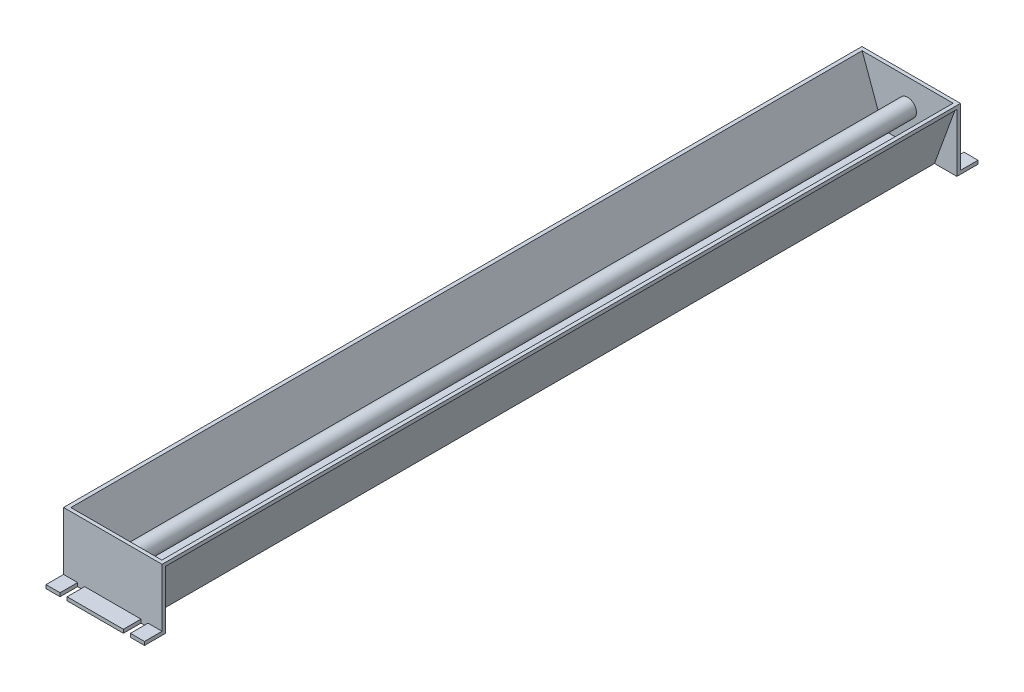
ISO-10303-21;
HEADER;
FILE_DESCRIPTION(('STEP AP214'),'2;1');
FILE_NAME('part.step','',(''),(''),'','','');
FILE_SCHEMA(('AUTOMOTIVE_DESIGN { 1 0 10303 214 1 1 1 1 }'));
ENDSEC;
DATA;
#1=APPLICATION_CONTEXT('core data for automotive mechanical design processes');
#2=APPLICATION_PROTOCOL_DEFINITION('international standard','automotive_design',2000,#1);
#3=PRODUCT_CONTEXT('',#1,'mechanical');
#4=PRODUCT('Part','Part','',(#3));
#5=PRODUCT_RELATED_PRODUCT_CATEGORY('part','',(#4));
#6=PRODUCT_DEFINITION_FORMATION('','',#4);
#7=PRODUCT_DEFINITION_CONTEXT('part definition',#1,'design');
#8=PRODUCT_DEFINITION('design','',#6,#7);
#9=PRODUCT_DEFINITION_SHAPE('','',#8);
#10=(LENGTH_UNIT() NAMED_UNIT(*) SI_UNIT(.MILLI.,.METRE.));
#11=(NAMED_UNIT(*) PLANE_ANGLE_UNIT() SI_UNIT($,.RADIAN.));
#12=(NAMED_UNIT(*) SI_UNIT($,.STERADIAN.) SOLID_ANGLE_UNIT());
#13=UNCERTAINTY_MEASURE_WITH_UNIT(LENGTH_MEASURE(1.E-05),#10,'distance_accuracy_value','');
#14=(GEOMETRIC_REPRESENTATION_CONTEXT(3) GLOBAL_UNCERTAINTY_ASSIGNED_CONTEXT((#13)) GLOBAL_UNIT_ASSIGNED_CONTEXT((#10,
#11,#12)) REPRESENTATION_CONTEXT('',''));
#15=CARTESIAN_POINT('',(0.,0.,0.));
#16=DIRECTION('',(0.,0.,1.));
#17=DIRECTION('',(1.,0.,0.));
#18=AXIS2_PLACEMENT_3D('',#15,#16,#17);
#19=CARTESIAN_POINT('',(0.,2.,-12.));
#20=DIRECTION('',(0.,-1.,0.));
#21=DIRECTION('',(1.,0.,0.));
#22=AXIS2_PLACEMENT_3D('',#19,#20,#21);
#23=PLANE('',#22);
#24=DIRECTION('',(1.,0.,0.));
#25=VECTOR('',#24,1.);
#26=CARTESIAN_POINT('',(0.,2.,-2.));
#27=LINE('',#26,#25);
#28=CARTESIAN_POINT('',(12.,2.,-2.));
#29=VERTEX_POINT('',#28);
#30=CARTESIAN_POINT('',(44.,2.00000000000001,-2.));
#31=VERTEX_POINT('',#30);
#32=EDGE_CURVE('E460',#29,#31,#27,.T.);
#33=ORIENTED_EDGE('',*,*,#32,.T.);
#34=DIRECTION('',(0.,0.,1.));
#35=VECTOR('',#34,1.);
#36=CARTESIAN_POINT('',(44.,2.00000000000001,-12.));
#37=LINE('',#36,#35);
#38=CARTESIAN_POINT('',(44.,2.00000000000001,-12.));
#39=VERTEX_POINT('',#38);
#40=EDGE_CURVE('E408',#39,#31,#37,.T.);
#41=ORIENTED_EDGE('',*,*,#40,.F.);
#42=DIRECTION('',(1.,0.,0.));
#43=VECTOR('',#42,1.);
#44=CARTESIAN_POINT('',(0.,2.,-12.));
#45=LINE('',#44,#43);
#46=CARTESIAN_POINT('',(12.,2.,-12.));
#47=VERTEX_POINT('',#46);
#48=EDGE_CURVE('E449',#47,#39,#45,.T.);
#49=ORIENTED_EDGE('',*,*,#48,.F.);
#50=DIRECTION('',(0.,0.,-1.));
#51=VECTOR('',#50,1.);
#52=CARTESIAN_POINT('',(12.,2.,-12.));
#53=LINE('',#52,#51);
#54=EDGE_CURVE('E100',#29,#47,#53,.T.);
#55=ORIENTED_EDGE('',*,*,#54,.F.);
#56=EDGE_LOOP('',(#33,#41,#49,#55));
#57=FACE_BOUND('',#56,.T.);
#58=ADVANCED_FACE('F77',(#57),#23,.F.);
#59=CARTESIAN_POINT('',(0.,2.,-2.));
#60=VERTEX_POINT('',#59);
#61=CARTESIAN_POINT('',(8.,2.,-2.));
#62=VERTEX_POINT('',#61);
#63=EDGE_CURVE('E444',#60,#62,#27,.T.);
#64=ORIENTED_EDGE('',*,*,#63,.T.);
#65=DIRECTION('',(0.,0.,1.));
#66=VECTOR('',#65,1.);
#67=CARTESIAN_POINT('',(8.,2.,-12.));
#68=LINE('',#67,#66);
#69=CARTESIAN_POINT('',(8.,2.,-12.));
#70=VERTEX_POINT('',#69);
#71=EDGE_CURVE('E415',#70,#62,#68,.T.);
#72=ORIENTED_EDGE('',*,*,#71,.F.);
#73=CARTESIAN_POINT('',(0.,2.,-12.));
#74=VERTEX_POINT('',#73);
#75=EDGE_CURVE('E445',#74,#70,#45,.T.);
#76=ORIENTED_EDGE('',*,*,#75,.F.);
#77=DIRECTION('',(0.,0.,1.));
#78=VECTOR('',#77,1.);
#79=CARTESIAN_POINT('',(0.,2.,-12.));
#80=LINE('',#79,#78);
#81=EDGE_CURVE('E463',#74,#60,#80,.T.);
#82=ORIENTED_EDGE('',*,*,#81,.T.);
#83=EDGE_LOOP('',(#64,#72,#76,#82));
#84=FACE_BOUND('',#83,.T.);
#85=ADVANCED_FACE('F687',(#84),#23,.F.);
#86=CARTESIAN_POINT('',(0.,0.,-12.));
#87=DIRECTION('',(0.,0.,-1.));
#88=DIRECTION('',(-1.,0.,0.));
#89=AXIS2_PLACEMENT_3D('',#86,#87,#88);
#90=PLANE('',#89);
#91=DIRECTION('',(0.,1.,0.));
#92=VECTOR('',#91,1.);
#93=CARTESIAN_POINT('',(44.,0.,-12.));
#94=LINE('',#93,#92);
#95=CARTESIAN_POINT('',(44.,0.,-12.));
#96=VERTEX_POINT('',#95);
#97=EDGE_CURVE('E12',#96,#39,#94,.T.);
#98=ORIENTED_EDGE('',*,*,#97,.F.);
#99=DIRECTION('',(1.,0.,0.));
#100=VECTOR('',#99,1.);
#101=CARTESIAN_POINT('',(0.,0.,-12.));
#102=LINE('',#101,#100);
#103=CARTESIAN_POINT('',(12.,0.,-12.));
#104=VERTEX_POINT('',#103);
#105=EDGE_CURVE('E457',#104,#96,#102,.T.);
#106=ORIENTED_EDGE('',*,*,#105,.F.);
#107=DIRECTION('',(0.,-1.,0.));
#108=VECTOR('',#107,1.);
#109=CARTESIAN_POINT('',(12.,0.,-12.));
#110=LINE('',#109,#108);
#111=EDGE_CURVE('E536',#47,#104,#110,.T.);
#112=ORIENTED_EDGE('',*,*,#111,.F.);
#113=ORIENTED_EDGE('',*,*,#48,.T.);
#114=EDGE_LOOP('',(#98,#106,#112,#113));
#115=FACE_BOUND('',#114,.T.);
#116=ADVANCED_FACE('F563',(#115),#90,.T.);
#117=DIRECTION('',(0.,1.,0.));
#118=VECTOR('',#117,1.);
#119=CARTESIAN_POINT('',(8.,0.,-12.));
#120=LINE('',#119,#118);
#121=CARTESIAN_POINT('',(8.,0.,-12.));
#122=VERTEX_POINT('',#121);
#123=EDGE_CURVE('E544',#122,#70,#120,.T.);
#124=ORIENTED_EDGE('',*,*,#123,.F.);
#125=CARTESIAN_POINT('',(0.,0.,-12.));
#126=VERTEX_POINT('',#125);
#127=EDGE_CURVE('E453',#126,#122,#102,.T.);
#128=ORIENTED_EDGE('',*,*,#127,.F.);
#129=DIRECTION('',(0.,1.,0.));
#130=VECTOR('',#129,1.);
#131=CARTESIAN_POINT('',(0.,0.,-12.));
#132=LINE('',#131,#130);
#133=EDGE_CURVE('E440',#126,#74,#132,.T.);
#134=ORIENTED_EDGE('',*,*,#133,.T.);
#135=ORIENTED_EDGE('',*,*,#75,.T.);
#136=EDGE_LOOP('',(#124,#128,#134,#135));
#137=FACE_BOUND('',#136,.T.);
#138=ADVANCED_FACE('F702',(#137),#90,.T.);
#139=CARTESIAN_POINT('',(0.,0.,-2.));
#140=DIRECTION('',(0.,0.,1.));
#141=DIRECTION('',(1.,0.,0.));
#142=AXIS2_PLACEMENT_3D('',#139,#140,#141);
#143=PLANE('',#142);
#144=ORIENTED_EDGE('',*,*,#63,.F.);
#145=DIRECTION('',(0.,1.,0.));
#146=VECTOR('',#145,1.);
#147=CARTESIAN_POINT('',(0.,0.,-2.));
#148=LINE('',#147,#146);
#149=CARTESIAN_POINT('',(0.,35.,-2.));
#150=VERTEX_POINT('',#149);
#151=EDGE_CURVE('E521',#60,#150,#148,.T.);
#152=ORIENTED_EDGE('',*,*,#151,.T.);
#153=DIRECTION('',(1.,0.,0.));
#154=VECTOR('',#153,1.);
#155=CARTESIAN_POINT('',(0.,35.,-2.));
#156=LINE('',#155,#154);
#157=CARTESIAN_POINT('',(56.,35.,-2.));
#158=VERTEX_POINT('',#157);
#159=EDGE_CURVE('E517',#150,#158,#156,.T.);
#160=ORIENTED_EDGE('',*,*,#159,.T.);
#161=DIRECTION('',(0.,1.,0.));
#162=VECTOR('',#161,1.);
#163=CARTESIAN_POINT('',(56.,0.,-2.));
#164=LINE('',#163,#162);
#165=CARTESIAN_POINT('',(56.,2.00000000000001,-2.));
#166=VERTEX_POINT('',#165);
#167=EDGE_CURVE('E515',#166,#158,#164,.T.);
#168=ORIENTED_EDGE('',*,*,#167,.F.);
#169=CARTESIAN_POINT('',(48.,2.00000000000001,-2.));
#170=VERTEX_POINT('',#169);
#171=EDGE_CURVE('E439',#170,#166,#27,.T.);
#172=ORIENTED_EDGE('',*,*,#171,.F.);
#173=DIRECTION('',(0.,1.,0.));
#174=VECTOR('',#173,1.);
#175=CARTESIAN_POINT('',(48.,-7.99999999999999,-2.));
#176=LINE('',#175,#174);
#177=CARTESIAN_POINT('',(48.,0.,-2.));
#178=VERTEX_POINT('',#177);
#179=EDGE_CURVE('E413',#178,#170,#176,.T.);
#180=ORIENTED_EDGE('',*,*,#179,.F.);
#181=DIRECTION('',(-1.,0.,0.));
#182=VECTOR('',#181,1.);
#183=CARTESIAN_POINT('',(0.,0.,-2.));
#184=LINE('',#183,#182);
#185=CARTESIAN_POINT('',(44.,0.,-2.));
#186=VERTEX_POINT('',#185);
#187=EDGE_CURVE('E434',#178,#186,#184,.T.);
#188=ORIENTED_EDGE('',*,*,#187,.T.);
#189=DIRECTION('',(0.,1.,0.));
#190=VECTOR('',#189,1.);
#191=CARTESIAN_POINT('',(44.,-7.99999999999999,-2.));
#192=LINE('',#191,#190);
#193=EDGE_CURVE('E412',#186,#31,#192,.T.);
#194=ORIENTED_EDGE('',*,*,#193,.T.);
#195=ORIENTED_EDGE('',*,*,#32,.F.);
#196=DIRECTION('',(0.,1.,0.));
#197=VECTOR('',#196,1.);
#198=CARTESIAN_POINT('',(12.,-8.,-2.));
#199=LINE('',#198,#197);
#200=CARTESIAN_POINT('',(12.,0.,-2.));
#201=VERTEX_POINT('',#200);
#202=EDGE_CURVE('E421',#201,#29,#199,.T.);
#203=ORIENTED_EDGE('',*,*,#202,.F.);
#204=DIRECTION('',(-1.,0.,0.));
#205=VECTOR('',#204,1.);
#206=CARTESIAN_POINT('',(0.,0.,-2.));
#207=LINE('',#206,#205);
#208=CARTESIAN_POINT('',(8.,0.,-2.));
#209=VERTEX_POINT('',#208);
#210=EDGE_CURVE('E432',#201,#209,#207,.T.);
#211=ORIENTED_EDGE('',*,*,#210,.T.);
#212=DIRECTION('',(0.,1.,0.));
#213=VECTOR('',#212,1.);
#214=CARTESIAN_POINT('',(8.00000000000001,-8.,-2.));
#215=LINE('',#214,#213);
#216=EDGE_CURVE('E420',#209,#62,#215,.T.);
#217=ORIENTED_EDGE('',*,*,#216,.T.);
#218=EDGE_LOOP('',(#144,#152,#160,#168,#172,#180,#188,#194,#195,#203,#211,#217));
#219=FACE_BOUND('',#218,.T.);
#220=ADVANCED_FACE('F580',(#219),#143,.F.);
#221=CARTESIAN_POINT('',(0.,0.,0.));
#222=DIRECTION('',(0.,0.,1.));
#223=DIRECTION('',(1.,0.,0.));
#224=AXIS2_PLACEMENT_3D('',#221,#222,#223);
#225=PLANE('',#224);
#226=CARTESIAN_POINT('',(28.,20.,0.));
#227=DIRECTION('',(0.,0.,1.));
#228=DIRECTION('',(1.,0.,0.));
#229=AXIS2_PLACEMENT_3D('',#226,#227,#228);
#230=CIRCLE('',#229,5.);
#231=CARTESIAN_POINT('',(33.,20.,0.));
#232=VERTEX_POINT('',#231);
#233=EDGE_CURVE('E436',#232,#232,#230,.T.);
#234=ORIENTED_EDGE('',*,*,#233,.F.);
#235=EDGE_LOOP('',(#234));
#236=FACE_BOUND('',#235,.T.);
#237=DIRECTION('',(1.,0.,0.));
#238=VECTOR('',#237,1.);
#239=CARTESIAN_POINT('',(0.,35.,0.));
#240=LINE('',#239,#238);
#241=CARTESIAN_POINT('',(2.12835554495183,35.,0.));
#242=VERTEX_POINT('',#241);
#243=CARTESIAN_POINT('',(53.8716444550482,35.,0.));
#244=VERTEX_POINT('',#243);
#245=EDGE_CURVE('E529',#242,#244,#240,.T.);
#246=ORIENTED_EDGE('',*,*,#245,.F.);
#247=DIRECTION('',(0.34202014332567,-0.939692620785908,0.));
#248=VECTOR('',#247,1.);
#249=CARTESIAN_POINT('',(13.1281684110863,4.77826253206926,0.));
#250=LINE('',#249,#248);
#251=CARTESIAN_POINT('',(14.1393732757366,2.,0.));
#252=VERTEX_POINT('',#251);
#253=EDGE_CURVE('E482',#242,#252,#250,.T.);
#254=ORIENTED_EDGE('',*,*,#253,.T.);
#255=DIRECTION('',(1.,0.,0.));
#256=VECTOR('',#255,1.);
#257=CARTESIAN_POINT('',(0.,2.,0.));
#258=LINE('',#257,#256);
#259=CARTESIAN_POINT('',(41.8606267242634,2.00000000000001,0.));
#260=VERTEX_POINT('',#259);
#261=EDGE_CURVE('E480',#252,#260,#258,.T.);
#262=ORIENTED_EDGE('',*,*,#261,.T.);
#263=DIRECTION('',(-0.34202014332567,-0.939692620785908,0.));
#264=VECTOR('',#263,1.);
#265=CARTESIAN_POINT('',(36.321075996245,-13.2197905391539,0.));
#266=LINE('',#265,#264);
#267=EDGE_CURVE('E477',#244,#260,#266,.T.);
#268=ORIENTED_EDGE('',*,*,#267,.F.);
#269=EDGE_LOOP('',(#246,#254,#262,#268));
#270=FACE_BOUND('',#269,.T.);
#271=ADVANCED_FACE('F732',(#236,#270),#225,.T.);
#272=DIRECTION('',(1.,0.,0.));
#273=VECTOR('',#272,1.);
#274=CARTESIAN_POINT('',(0.,33.,0.));
#275=LINE('',#274,#273);
#276=CARTESIAN_POINT('',(55.2720595314676,33.,0.));
#277=VERTEX_POINT('',#276);
#278=CARTESIAN_POINT('',(56.,33.,0.));
#279=VERTEX_POINT('',#278);
#280=EDGE_CURVE('E474',#277,#279,#275,.T.);
#281=ORIENTED_EDGE('',*,*,#280,.F.);
#282=DIRECTION('',(-0.34202014332567,-0.939692620785908,0.));
#283=VECTOR('',#282,1.);
#284=CARTESIAN_POINT('',(38.2004612378169,-13.9038308258052,0.));
#285=LINE('',#284,#283);
#286=CARTESIAN_POINT('',(43.2610418006829,0.,0.));
#287=VERTEX_POINT('',#286);
#288=EDGE_CURVE('E472',#277,#287,#285,.T.);
#289=ORIENTED_EDGE('',*,*,#288,.T.);
#290=DIRECTION('',(1.,0.,0.));
#291=VECTOR('',#290,1.);
#292=CARTESIAN_POINT('',(0.,0.,0.));
#293=LINE('',#292,#291);
#294=CARTESIAN_POINT('',(56.,0.,0.));
#295=VERTEX_POINT('',#294);
#296=EDGE_CURVE('E527',#287,#295,#293,.T.);
#297=ORIENTED_EDGE('',*,*,#296,.T.);
#298=DIRECTION('',(0.,1.,0.));
#299=VECTOR('',#298,1.);
#300=CARTESIAN_POINT('',(56.,0.,0.));
#301=LINE('',#300,#299);
#302=EDGE_CURVE('E526',#295,#279,#301,.T.);
#303=ORIENTED_EDGE('',*,*,#302,.T.);
#304=EDGE_LOOP('',(#281,#289,#297,#303));
#305=FACE_BOUND('',#304,.T.);
#306=ADVANCED_FACE('F736',(#305),#225,.T.);
#307=DIRECTION('',(0.34202014332567,-0.939692620785908,0.));
#308=VECTOR('',#307,1.);
#309=CARTESIAN_POINT('',(11.2487831695145,4.09422224541792,0.));
#310=LINE('',#309,#308);
#311=CARTESIAN_POINT('',(0.727940468532409,33.,0.));
#312=VERTEX_POINT('',#311);
#313=CARTESIAN_POINT('',(12.7389581993171,0.,0.));
#314=VERTEX_POINT('',#313);
#315=EDGE_CURVE('E469',#312,#314,#310,.T.);
#316=ORIENTED_EDGE('',*,*,#315,.F.);
#317=DIRECTION('',(1.,0.,0.));
#318=VECTOR('',#317,1.);
#319=CARTESIAN_POINT('',(0.,33.,0.));
#320=LINE('',#319,#318);
#321=CARTESIAN_POINT('',(0.,33.,0.));
#322=VERTEX_POINT('',#321);
#323=EDGE_CURVE('E466',#322,#312,#320,.T.);
#324=ORIENTED_EDGE('',*,*,#323,.F.);
#325=DIRECTION('',(0.,1.,0.));
#326=VECTOR('',#325,1.);
#327=CARTESIAN_POINT('',(0.,0.,0.));
#328=LINE('',#327,#326);
#329=CARTESIAN_POINT('',(0.,0.,0.));
#330=VERTEX_POINT('',#329);
#331=EDGE_CURVE('E518',#330,#322,#328,.T.);
#332=ORIENTED_EDGE('',*,*,#331,.F.);
#333=EDGE_CURVE('E524',#330,#314,#293,.T.);
#334=ORIENTED_EDGE('',*,*,#333,.T.);
#335=EDGE_LOOP('',(#316,#324,#332,#334));
#336=FACE_BOUND('',#335,.T.);
#337=ADVANCED_FACE('F733',(#336),#225,.T.);
#338=CARTESIAN_POINT('',(0.,0.,-2.));
#339=DIRECTION('',(1.,0.,0.));
#340=DIRECTION('',(0.,0.,-1.));
#341=AXIS2_PLACEMENT_3D('',#338,#339,#340);
#342=PLANE('',#341);
#343=ORIENTED_EDGE('',*,*,#331,.T.);
#344=DIRECTION('',(0.,0.,-1.));
#345=VECTOR('',#344,1.);
#346=CARTESIAN_POINT('',(0.,33.,225.));
#347=LINE('',#346,#345);
#348=CARTESIAN_POINT('',(0.,33.,450.));
#349=VERTEX_POINT('',#348);
#350=EDGE_CURVE('E511',#349,#322,#347,.T.);
#351=ORIENTED_EDGE('',*,*,#350,.F.);
#352=DIRECTION('',(0.,1.,0.));
#353=VECTOR('',#352,1.);
#354=CARTESIAN_POINT('',(0.,0.,450.));
#355=LINE('',#354,#353);
#356=CARTESIAN_POINT('',(0.,0.,450.));
#357=VERTEX_POINT('',#356);
#358=EDGE_CURVE('E378',#357,#349,#355,.T.);
#359=ORIENTED_EDGE('',*,*,#358,.F.);
#360=DIRECTION('',(0.,0.,-1.));
#361=VECTOR('',#360,1.);
#362=CARTESIAN_POINT('',(0.,0.,452.));
#363=LINE('',#362,#361);
#364=CARTESIAN_POINT('',(0.,0.,462.));
#365=VERTEX_POINT('',#364);
#366=EDGE_CURVE('E373',#365,#357,#363,.T.);
#367=ORIENTED_EDGE('',*,*,#366,.F.);
#368=DIRECTION('',(0.,1.,0.));
#369=VECTOR('',#368,1.);
#370=CARTESIAN_POINT('',(0.,0.,462.));
#371=LINE('',#370,#369);
#372=CARTESIAN_POINT('',(0.,2.,462.));
#373=VERTEX_POINT('',#372);
#374=EDGE_CURVE('E340',#365,#373,#371,.T.);
#375=ORIENTED_EDGE('',*,*,#374,.T.);
#376=DIRECTION('',(0.,0.,-1.));
#377=VECTOR('',#376,1.);
#378=CARTESIAN_POINT('',(0.,2.,462.));
#379=LINE('',#378,#377);
#380=CARTESIAN_POINT('',(0.,2.,452.));
#381=VERTEX_POINT('',#380);
#382=EDGE_CURVE('E349',#373,#381,#379,.T.);
#383=ORIENTED_EDGE('',*,*,#382,.T.);
#384=DIRECTION('',(0.,1.,0.));
#385=VECTOR('',#384,1.);
#386=CARTESIAN_POINT('',(0.,0.,452.));
#387=LINE('',#386,#385);
#388=CARTESIAN_POINT('',(0.,35.,452.));
#389=VERTEX_POINT('',#388);
#390=EDGE_CURVE('E381',#381,#389,#387,.T.);
#391=ORIENTED_EDGE('',*,*,#390,.T.);
#392=DIRECTION('',(0.,0.,1.));
#393=VECTOR('',#392,1.);
#394=CARTESIAN_POINT('',(0.,35.,-2.));
#395=LINE('',#394,#393);
#396=EDGE_CURVE('E534',#150,#389,#395,.T.);
#397=ORIENTED_EDGE('',*,*,#396,.F.);
#398=ORIENTED_EDGE('',*,*,#151,.F.);
#399=ORIENTED_EDGE('',*,*,#81,.F.);
#400=ORIENTED_EDGE('',*,*,#133,.F.);
#401=DIRECTION('',(0.,0.,1.));
#402=VECTOR('',#401,1.);
#403=CARTESIAN_POINT('',(0.,0.,-2.));
#404=LINE('',#403,#402);
#405=EDGE_CURVE('E514',#126,#330,#404,.T.);
#406=ORIENTED_EDGE('',*,*,#405,.T.);
#407=EDGE_LOOP('',(#343,#351,#359,#367,#375,#383,#391,#397,#398,#399,#400,#406));
#408=FACE_BOUND('',#407,.T.);
#409=ADVANCED_FACE('F672',(#408),#342,.F.);
#410=CARTESIAN_POINT('',(0.,0.,-2.));
#411=DIRECTION('',(0.,-1.,0.));
#412=DIRECTION('',(1.,0.,0.));
#413=AXIS2_PLACEMENT_3D('',#410,#411,#412);
#414=PLANE('',#413);
#415=DIRECTION('',(0.,0.,-1.));
#416=VECTOR('',#415,1.);
#417=CARTESIAN_POINT('',(44.,0.,-2.));
#418=LINE('',#417,#416);
#419=EDGE_CURVE('E430',#186,#96,#418,.T.);
#420=ORIENTED_EDGE('',*,*,#419,.F.);
#421=ORIENTED_EDGE('',*,*,#187,.F.);
#422=DIRECTION('',(0.,0.,1.));
#423=VECTOR('',#422,1.);
#424=CARTESIAN_POINT('',(48.,0.,-2.));
#425=LINE('',#424,#423);
#426=CARTESIAN_POINT('',(48.,0.,-12.));
#427=VERTEX_POINT('',#426);
#428=EDGE_CURVE('E428',#427,#178,#425,.T.);
#429=ORIENTED_EDGE('',*,*,#428,.F.);
#430=CARTESIAN_POINT('',(56.,0.,-12.));
#431=VERTEX_POINT('',#430);
#432=EDGE_CURVE('E452',#427,#431,#102,.T.);
#433=ORIENTED_EDGE('',*,*,#432,.T.);
#434=DIRECTION('',(0.,0.,1.));
#435=VECTOR('',#434,1.);
#436=CARTESIAN_POINT('',(56.,0.,-2.));
#437=LINE('',#436,#435);
#438=EDGE_CURVE('E540',#431,#295,#437,.T.);
#439=ORIENTED_EDGE('',*,*,#438,.T.);
#440=ORIENTED_EDGE('',*,*,#296,.F.);
#441=DIRECTION('',(0.,0.,-1.));
#442=VECTOR('',#441,1.);
#443=CARTESIAN_POINT('',(43.2610418006829,0.,225.));
#444=LINE('',#443,#442);
#445=CARTESIAN_POINT('',(43.2610418006829,0.,450.));
#446=VERTEX_POINT('',#445);
#447=EDGE_CURVE('E502',#446,#287,#444,.T.);
#448=ORIENTED_EDGE('',*,*,#447,.F.);
#449=DIRECTION('',(1.,0.,0.));
#450=VECTOR('',#449,1.);
#451=CARTESIAN_POINT('',(0.,0.,450.));
#452=LINE('',#451,#450);
#453=CARTESIAN_POINT('',(56.,0.,450.));
#454=VERTEX_POINT('',#453);
#455=EDGE_CURVE('E389',#446,#454,#452,.T.);
#456=ORIENTED_EDGE('',*,*,#455,.T.);
#457=DIRECTION('',(0.,0.,-1.));
#458=VECTOR('',#457,1.);
#459=CARTESIAN_POINT('',(56.,0.,452.));
#460=LINE('',#459,#458);
#461=CARTESIAN_POINT('',(56.,0.,462.));
#462=VERTEX_POINT('',#461);
#463=EDGE_CURVE('E398',#462,#454,#460,.T.);
#464=ORIENTED_EDGE('',*,*,#463,.F.);
#465=DIRECTION('',(1.,0.,0.));
#466=VECTOR('',#465,1.);
#467=CARTESIAN_POINT('',(0.,0.,462.));
#468=LINE('',#467,#466);
#469=CARTESIAN_POINT('',(48.,0.,462.));
#470=VERTEX_POINT('',#469);
#471=EDGE_CURVE('E601',#470,#462,#468,.T.);
#472=ORIENTED_EDGE('',*,*,#471,.F.);
#473=DIRECTION('',(0.,0.,-1.));
#474=VECTOR('',#473,1.);
#475=CARTESIAN_POINT('',(48.,0.,452.));
#476=LINE('',#475,#474);
#477=CARTESIAN_POINT('',(48.,0.,452.));
#478=VERTEX_POINT('',#477);
#479=EDGE_CURVE('E650',#470,#478,#476,.T.);
#480=ORIENTED_EDGE('',*,*,#479,.T.);
#481=DIRECTION('',(-1.,0.,0.));
#482=VECTOR('',#481,1.);
#483=CARTESIAN_POINT('',(0.,0.,452.));
#484=LINE('',#483,#482);
#485=CARTESIAN_POINT('',(44.,0.,452.));
#486=VERTEX_POINT('',#485);
#487=EDGE_CURVE('E645',#478,#486,#484,.T.);
#488=ORIENTED_EDGE('',*,*,#487,.T.);
#489=DIRECTION('',(0.,0.,1.));
#490=VECTOR('',#489,1.);
#491=CARTESIAN_POINT('',(44.,0.,452.));
#492=LINE('',#491,#490);
#493=CARTESIAN_POINT('',(44.,0.,462.));
#494=VERTEX_POINT('',#493);
#495=EDGE_CURVE('E315',#486,#494,#492,.T.);
#496=ORIENTED_EDGE('',*,*,#495,.T.);
#497=CARTESIAN_POINT('',(12.,0.,462.));
#498=VERTEX_POINT('',#497);
#499=EDGE_CURVE('E611',#498,#494,#468,.T.);
#500=ORIENTED_EDGE('',*,*,#499,.F.);
#501=DIRECTION('',(0.,0.,-1.));
#502=VECTOR('',#501,1.);
#503=CARTESIAN_POINT('',(12.,0.,452.));
#504=LINE('',#503,#502);
#505=CARTESIAN_POINT('',(12.,0.,452.));
#506=VERTEX_POINT('',#505);
#507=EDGE_CURVE('E653',#498,#506,#504,.T.);
#508=ORIENTED_EDGE('',*,*,#507,.T.);
#509=DIRECTION('',(-1.,0.,0.));
#510=VECTOR('',#509,1.);
#511=CARTESIAN_POINT('',(0.,0.,452.));
#512=LINE('',#511,#510);
#513=CARTESIAN_POINT('',(8.,0.,452.));
#514=VERTEX_POINT('',#513);
#515=EDGE_CURVE('E647',#506,#514,#512,.T.);
#516=ORIENTED_EDGE('',*,*,#515,.T.);
#517=DIRECTION('',(0.,0.,1.));
#518=VECTOR('',#517,1.);
#519=CARTESIAN_POINT('',(8.,0.,452.));
#520=LINE('',#519,#518);
#521=CARTESIAN_POINT('',(8.,0.,462.));
#522=VERTEX_POINT('',#521);
#523=EDGE_CURVE('E623',#514,#522,#520,.T.);
#524=ORIENTED_EDGE('',*,*,#523,.T.);
#525=EDGE_CURVE('E345',#365,#522,#468,.T.);
#526=ORIENTED_EDGE('',*,*,#525,.F.);
#527=ORIENTED_EDGE('',*,*,#366,.T.);
#528=CARTESIAN_POINT('',(12.7389581993171,0.,450.));
#529=VERTEX_POINT('',#528);
#530=EDGE_CURVE('E385',#357,#529,#452,.T.);
#531=ORIENTED_EDGE('',*,*,#530,.T.);
#532=DIRECTION('',(0.,0.,-1.));
#533=VECTOR('',#532,1.);
#534=CARTESIAN_POINT('',(12.7389581993171,0.,225.));
#535=LINE('',#534,#533);
#536=EDGE_CURVE('E505',#529,#314,#535,.T.);
#537=ORIENTED_EDGE('',*,*,#536,.T.);
#538=ORIENTED_EDGE('',*,*,#333,.F.);
#539=ORIENTED_EDGE('',*,*,#405,.F.);
#540=ORIENTED_EDGE('',*,*,#127,.T.);
#541=DIRECTION('',(0.,0.,-1.));
#542=VECTOR('',#541,1.);
#543=CARTESIAN_POINT('',(8.,0.,-2.));
#544=LINE('',#543,#542);
#545=EDGE_CURVE('E426',#209,#122,#544,.T.);
#546=ORIENTED_EDGE('',*,*,#545,.F.);
#547=ORIENTED_EDGE('',*,*,#210,.F.);
#548=DIRECTION('',(0.,0.,1.));
#549=VECTOR('',#548,1.);
#550=CARTESIAN_POINT('',(12.,0.,-2.));
#551=LINE('',#550,#549);
#552=EDGE_CURVE('E423',#104,#201,#551,.T.);
#553=ORIENTED_EDGE('',*,*,#552,.F.);
#554=ORIENTED_EDGE('',*,*,#105,.T.);
#555=EDGE_LOOP('',(#420,#421,#429,#433,#439,#440,#448,#456,#464,#472,#480,#488,#496,#500,#508,
#516,#524,#526,#527,#531,#537,#538,#539,#540,#546,#547,#553,#554));
#556=FACE_BOUND('',#555,.T.);
#557=ADVANCED_FACE('F79',(#556),#414,.T.);
#558=CARTESIAN_POINT('',(56.,0.,-2.));
#559=DIRECTION('',(1.,0.,0.));
#560=DIRECTION('',(0.,0.,-1.));
#561=AXIS2_PLACEMENT_3D('',#558,#559,#560);
#562=PLANE('',#561);
#563=ORIENTED_EDGE('',*,*,#302,.F.);
#564=ORIENTED_EDGE('',*,*,#438,.F.);
#565=DIRECTION('',(0.,1.,0.));
#566=VECTOR('',#565,1.);
#567=CARTESIAN_POINT('',(56.,0.,-12.));
#568=LINE('',#567,#566);
#569=CARTESIAN_POINT('',(56.,2.00000000000001,-12.));
#570=VERTEX_POINT('',#569);
#571=EDGE_CURVE('E448',#431,#570,#568,.T.);
#572=ORIENTED_EDGE('',*,*,#571,.T.);
#573=DIRECTION('',(0.,0.,1.));
#574=VECTOR('',#573,1.);
#575=CARTESIAN_POINT('',(56.,2.00000000000001,-12.));
#576=LINE('',#575,#574);
#577=EDGE_CURVE('E456',#570,#166,#576,.T.);
#578=ORIENTED_EDGE('',*,*,#577,.T.);
#579=ORIENTED_EDGE('',*,*,#167,.T.);
#580=DIRECTION('',(0.,0.,1.));
#581=VECTOR('',#580,1.);
#582=CARTESIAN_POINT('',(56.,35.,-2.));
#583=LINE('',#582,#581);
#584=CARTESIAN_POINT('',(56.,35.,452.));
#585=VERTEX_POINT('',#584);
#586=EDGE_CURVE('E523',#158,#585,#583,.T.);
#587=ORIENTED_EDGE('',*,*,#586,.T.);
#588=DIRECTION('',(0.,1.,0.));
#589=VECTOR('',#588,1.);
#590=CARTESIAN_POINT('',(56.,0.,452.));
#591=LINE('',#590,#589);
#592=CARTESIAN_POINT('',(56.,2.00000000000001,452.));
#593=VERTEX_POINT('',#592);
#594=EDGE_CURVE('E374',#593,#585,#591,.T.);
#595=ORIENTED_EDGE('',*,*,#594,.F.);
#596=DIRECTION('',(0.,0.,-1.));
#597=VECTOR('',#596,1.);
#598=CARTESIAN_POINT('',(56.,2.00000000000001,462.));
#599=LINE('',#598,#597);
#600=CARTESIAN_POINT('',(56.,2.00000000000001,462.));
#601=VERTEX_POINT('',#600);
#602=EDGE_CURVE('E347',#601,#593,#599,.T.);
#603=ORIENTED_EDGE('',*,*,#602,.F.);
#604=DIRECTION('',(0.,1.,0.));
#605=VECTOR('',#604,1.);
#606=CARTESIAN_POINT('',(56.,0.,462.));
#607=LINE('',#606,#605);
#608=EDGE_CURVE('E604',#462,#601,#607,.T.);
#609=ORIENTED_EDGE('',*,*,#608,.F.);
#610=ORIENTED_EDGE('',*,*,#463,.T.);
#611=DIRECTION('',(0.,1.,0.));
#612=VECTOR('',#611,1.);
#613=CARTESIAN_POINT('',(56.,0.,450.));
#614=LINE('',#613,#612);
#615=CARTESIAN_POINT('',(56.,33.,450.));
#616=VERTEX_POINT('',#615);
#617=EDGE_CURVE('E388',#454,#616,#614,.T.);
#618=ORIENTED_EDGE('',*,*,#617,.T.);
#619=DIRECTION('',(0.,0.,-1.));
#620=VECTOR('',#619,1.);
#621=CARTESIAN_POINT('',(56.,33.,225.));
#622=LINE('',#621,#620);
#623=EDGE_CURVE('E496',#616,#279,#622,.T.);
#624=ORIENTED_EDGE('',*,*,#623,.T.);
#625=EDGE_LOOP('',(#563,#564,#572,#578,#579,#587,#595,#603,#609,#610,#618,#624));
#626=FACE_BOUND('',#625,.T.);
#627=ADVANCED_FACE('F585',(#626),#562,.T.);
#628=CARTESIAN_POINT('',(0.,35.,-2.));
#629=DIRECTION('',(0.,-1.,0.));
#630=DIRECTION('',(1.,0.,0.));
#631=AXIS2_PLACEMENT_3D('',#628,#629,#630);
#632=PLANE('',#631);
#633=DIRECTION('',(1.,0.,0.));
#634=VECTOR('',#633,1.);
#635=CARTESIAN_POINT('',(0.,35.,452.));
#636=LINE('',#635,#634);
#637=EDGE_CURVE('E377',#389,#585,#636,.T.);
#638=ORIENTED_EDGE('',*,*,#637,.T.);
#639=ORIENTED_EDGE('',*,*,#586,.F.);
#640=ORIENTED_EDGE('',*,*,#159,.F.);
#641=ORIENTED_EDGE('',*,*,#396,.T.);
#642=EDGE_LOOP('',(#638,#639,#640,#641));
#643=FACE_BOUND('',#642,.T.);
#644=DIRECTION('',(0.,0.,-1.));
#645=VECTOR('',#644,1.);
#646=CARTESIAN_POINT('',(53.8716444550482,35.,225.));
#647=LINE('',#646,#645);
#648=CARTESIAN_POINT('',(53.8716444550482,35.,450.));
#649=VERTEX_POINT('',#648);
#650=EDGE_CURVE('E493',#649,#244,#647,.T.);
#651=ORIENTED_EDGE('',*,*,#650,.F.);
#652=DIRECTION('',(1.,0.,0.));
#653=VECTOR('',#652,1.);
#654=CARTESIAN_POINT('',(0.,35.,450.));
#655=LINE('',#654,#653);
#656=CARTESIAN_POINT('',(2.12835554495183,35.,450.));
#657=VERTEX_POINT('',#656);
#658=EDGE_CURVE('E392',#657,#649,#655,.T.);
#659=ORIENTED_EDGE('',*,*,#658,.F.);
#660=DIRECTION('',(0.,0.,-1.));
#661=VECTOR('',#660,1.);
#662=CARTESIAN_POINT('',(2.12835554495183,35.,225.));
#663=LINE('',#662,#661);
#664=EDGE_CURVE('E484',#657,#242,#663,.T.);
#665=ORIENTED_EDGE('',*,*,#664,.T.);
#666=ORIENTED_EDGE('',*,*,#245,.T.);
#667=EDGE_LOOP('',(#651,#659,#665,#666));
#668=FACE_BOUND('',#667,.T.);
#669=ADVANCED_FACE('F668',(#643,#668),#632,.F.);
#670=CARTESIAN_POINT('',(0.,33.,225.));
#671=DIRECTION('',(0.,1.,0.));
#672=DIRECTION('',(-1.,0.,0.));
#673=AXIS2_PLACEMENT_3D('',#670,#671,#672);
#674=PLANE('',#673);
#675=ORIENTED_EDGE('',*,*,#323,.T.);
#676=DIRECTION('',(0.,0.,-1.));
#677=VECTOR('',#676,1.);
#678=CARTESIAN_POINT('',(0.727940468532409,33.,225.));
#679=LINE('',#678,#677);
#680=CARTESIAN_POINT('',(0.727940468532409,33.,450.));
#681=VERTEX_POINT('',#680);
#682=EDGE_CURVE('E508',#681,#312,#679,.T.);
#683=ORIENTED_EDGE('',*,*,#682,.F.);
#684=DIRECTION('',(1.,0.,0.));
#685=VECTOR('',#684,1.);
#686=CARTESIAN_POINT('',(0.,33.,450.));
#687=LINE('',#686,#685);
#688=EDGE_CURVE('E352',#349,#681,#687,.T.);
#689=ORIENTED_EDGE('',*,*,#688,.F.);
#690=ORIENTED_EDGE('',*,*,#350,.T.);
#691=EDGE_LOOP('',(#675,#683,#689,#690));
#692=FACE_BOUND('',#691,.T.);
#693=ADVANCED_FACE('F725',(#692),#674,.F.);
#694=CARTESIAN_POINT('',(11.2487831695145,4.09422224541792,225.));
#695=DIRECTION('',(0.939692620785908,0.34202014332567,0.));
#696=DIRECTION('',(-0.34202014332567,0.939692620785908,0.));
#697=AXIS2_PLACEMENT_3D('',#694,#695,#696);
#698=PLANE('',#697);
#699=ORIENTED_EDGE('',*,*,#315,.T.);
#700=ORIENTED_EDGE('',*,*,#536,.F.);
#701=DIRECTION('',(0.34202014332567,-0.939692620785908,0.));
#702=VECTOR('',#701,1.);
#703=CARTESIAN_POINT('',(11.2487831695145,4.09422224541792,450.));
#704=LINE('',#703,#702);
#705=EDGE_CURVE('E355',#681,#529,#704,.T.);
#706=ORIENTED_EDGE('',*,*,#705,.F.);
#707=ORIENTED_EDGE('',*,*,#682,.T.);
#708=EDGE_LOOP('',(#699,#700,#706,#707));
#709=FACE_BOUND('',#708,.T.);
#710=ADVANCED_FACE('F722',(#709),#698,.F.);
#711=CARTESIAN_POINT('',(38.2004612378169,-13.9038308258052,225.));
#712=DIRECTION('',(0.939692620785908,-0.34202014332567,0.));
#713=DIRECTION('',(0.34202014332567,0.939692620785908,0.));
#714=AXIS2_PLACEMENT_3D('',#711,#712,#713);
#715=PLANE('',#714);
#716=ORIENTED_EDGE('',*,*,#288,.F.);
#717=DIRECTION('',(0.,0.,-1.));
#718=VECTOR('',#717,1.);
#719=CARTESIAN_POINT('',(55.2720595314676,33.,225.));
#720=LINE('',#719,#718);
#721=CARTESIAN_POINT('',(55.2720595314676,33.,450.));
#722=VERTEX_POINT('',#721);
#723=EDGE_CURVE('E499',#722,#277,#720,.T.);
#724=ORIENTED_EDGE('',*,*,#723,.F.);
#725=DIRECTION('',(-0.34202014332567,-0.939692620785908,0.));
#726=VECTOR('',#725,1.);
#727=CARTESIAN_POINT('',(38.2004612378169,-13.9038308258052,450.));
#728=LINE('',#727,#726);
#729=EDGE_CURVE('E358',#722,#446,#728,.T.);
#730=ORIENTED_EDGE('',*,*,#729,.T.);
#731=ORIENTED_EDGE('',*,*,#447,.T.);
#732=EDGE_LOOP('',(#716,#724,#730,#731));
#733=FACE_BOUND('',#732,.T.);
#734=ADVANCED_FACE('F591',(#733),#715,.T.);
#735=CARTESIAN_POINT('',(0.,33.,225.));
#736=DIRECTION('',(0.,1.,0.));
#737=DIRECTION('',(-1.,0.,0.));
#738=AXIS2_PLACEMENT_3D('',#735,#736,#737);
#739=PLANE('',#738);
#740=ORIENTED_EDGE('',*,*,#280,.T.);
#741=ORIENTED_EDGE('',*,*,#623,.F.);
#742=DIRECTION('',(1.,0.,0.));
#743=VECTOR('',#742,1.);
#744=CARTESIAN_POINT('',(0.,33.,450.));
#745=LINE('',#744,#743);
#746=EDGE_CURVE('E361',#722,#616,#745,.T.);
#747=ORIENTED_EDGE('',*,*,#746,.F.);
#748=ORIENTED_EDGE('',*,*,#723,.T.);
#749=EDGE_LOOP('',(#740,#741,#747,#748));
#750=FACE_BOUND('',#749,.T.);
#751=ADVANCED_FACE('F715',(#750),#739,.F.);
#752=CARTESIAN_POINT('',(36.321075996245,-13.2197905391539,225.));
#753=DIRECTION('',(0.939692620785908,-0.34202014332567,0.));
#754=DIRECTION('',(0.34202014332567,0.939692620785908,0.));
#755=AXIS2_PLACEMENT_3D('',#752,#753,#754);
#756=PLANE('',#755);
#757=ORIENTED_EDGE('',*,*,#267,.T.);
#758=DIRECTION('',(0.,0.,-1.));
#759=VECTOR('',#758,1.);
#760=CARTESIAN_POINT('',(41.8606267242634,2.00000000000001,225.));
#761=LINE('',#760,#759);
#762=CARTESIAN_POINT('',(41.8606267242634,2.00000000000001,450.));
#763=VERTEX_POINT('',#762);
#764=EDGE_CURVE('E490',#763,#260,#761,.T.);
#765=ORIENTED_EDGE('',*,*,#764,.F.);
#766=DIRECTION('',(-0.34202014332567,-0.939692620785908,0.));
#767=VECTOR('',#766,1.);
#768=CARTESIAN_POINT('',(36.321075996245,-13.2197905391539,450.));
#769=LINE('',#768,#767);
#770=EDGE_CURVE('E364',#649,#763,#769,.T.);
#771=ORIENTED_EDGE('',*,*,#770,.F.);
#772=ORIENTED_EDGE('',*,*,#650,.T.);
#773=EDGE_LOOP('',(#757,#765,#771,#772));
#774=FACE_BOUND('',#773,.T.);
#775=ADVANCED_FACE('F708',(#774),#756,.F.);
#776=CARTESIAN_POINT('',(0.,2.,225.));
#777=DIRECTION('',(0.,1.,0.));
#778=DIRECTION('',(-1.,0.,0.));
#779=AXIS2_PLACEMENT_3D('',#776,#777,#778);
#780=PLANE('',#779);
#781=ORIENTED_EDGE('',*,*,#261,.F.);
#782=DIRECTION('',(0.,0.,-1.));
#783=VECTOR('',#782,1.);
#784=CARTESIAN_POINT('',(14.1393732757366,2.,225.));
#785=LINE('',#784,#783);
#786=CARTESIAN_POINT('',(14.1393732757366,2.,450.));
#787=VERTEX_POINT('',#786);
#788=EDGE_CURVE('E487',#787,#252,#785,.T.);
#789=ORIENTED_EDGE('',*,*,#788,.F.);
#790=DIRECTION('',(1.,0.,0.));
#791=VECTOR('',#790,1.);
#792=CARTESIAN_POINT('',(0.,2.,450.));
#793=LINE('',#792,#791);
#794=EDGE_CURVE('E367',#787,#763,#793,.T.);
#795=ORIENTED_EDGE('',*,*,#794,.T.);
#796=ORIENTED_EDGE('',*,*,#764,.T.);
#797=EDGE_LOOP('',(#781,#789,#795,#796));
#798=FACE_BOUND('',#797,.T.);
#799=ADVANCED_FACE('F703',(#798),#780,.T.);
#800=CARTESIAN_POINT('',(13.1281684110863,4.77826253206926,225.));
#801=DIRECTION('',(0.939692620785908,0.34202014332567,0.));
#802=DIRECTION('',(-0.34202014332567,0.939692620785908,0.));
#803=AXIS2_PLACEMENT_3D('',#800,#801,#802);
#804=PLANE('',#803);
#805=ORIENTED_EDGE('',*,*,#253,.F.);
#806=ORIENTED_EDGE('',*,*,#664,.F.);
#807=DIRECTION('',(0.34202014332567,-0.939692620785908,0.));
#808=VECTOR('',#807,1.);
#809=CARTESIAN_POINT('',(13.1281684110863,4.77826253206926,450.));
#810=LINE('',#809,#808);
#811=EDGE_CURVE('E370',#657,#787,#810,.T.);
#812=ORIENTED_EDGE('',*,*,#811,.T.);
#813=ORIENTED_EDGE('',*,*,#788,.T.);
#814=EDGE_LOOP('',(#805,#806,#812,#813));
#815=FACE_BOUND('',#814,.T.);
#816=ADVANCED_FACE('F696',(#815),#804,.T.);
#817=CARTESIAN_POINT('',(48.,2.00000000000001,-12.));
#818=VERTEX_POINT('',#817);
#819=EDGE_CURVE('E443',#818,#570,#45,.T.);
#820=ORIENTED_EDGE('',*,*,#819,.F.);
#821=DIRECTION('',(0.,0.,-1.));
#822=VECTOR('',#821,1.);
#823=CARTESIAN_POINT('',(48.,2.00000000000001,-12.));
#824=LINE('',#823,#822);
#825=EDGE_CURVE('E92',#170,#818,#824,.T.);
#826=ORIENTED_EDGE('',*,*,#825,.F.);
#827=ORIENTED_EDGE('',*,*,#171,.T.);
#828=ORIENTED_EDGE('',*,*,#577,.F.);
#829=EDGE_LOOP('',(#820,#826,#827,#828));
#830=FACE_BOUND('',#829,.T.);
#831=ADVANCED_FACE('F579',(#830),#23,.F.);
#832=DIRECTION('',(0.,-1.,0.));
#833=VECTOR('',#832,1.);
#834=CARTESIAN_POINT('',(48.,0.,-12.));
#835=LINE('',#834,#833);
#836=EDGE_CURVE('E85',#818,#427,#835,.T.);
#837=ORIENTED_EDGE('',*,*,#836,.F.);
#838=ORIENTED_EDGE('',*,*,#819,.T.);
#839=ORIENTED_EDGE('',*,*,#571,.F.);
#840=ORIENTED_EDGE('',*,*,#432,.F.);
#841=EDGE_LOOP('',(#837,#838,#839,#840));
#842=FACE_BOUND('',#841,.T.);
#843=ADVANCED_FACE('F556',(#842),#90,.T.);
#844=CARTESIAN_POINT('',(28.,20.,239.142135623731));
#845=DIRECTION('',(0.,0.,-1.));
#846=DIRECTION('',(-1.,0.,0.));
#847=AXIS2_PLACEMENT_3D('',#844,#845,#846);
#848=CYLINDRICAL_SURFACE('',#847,5.);
#849=ORIENTED_EDGE('',*,*,#233,.T.);
#850=EDGE_LOOP('',(#849));
#851=FACE_BOUND('',#850,.T.);
#852=CARTESIAN_POINT('',(28.,20.,450.));
#853=DIRECTION('',(0.,0.,1.));
#854=DIRECTION('',(1.,0.,0.));
#855=AXIS2_PLACEMENT_3D('',#852,#853,#854);
#856=CIRCLE('',#855,5.);
#857=CARTESIAN_POINT('',(33.,20.,450.));
#858=VERTEX_POINT('',#857);
#859=EDGE_CURVE('E342',#858,#858,#856,.T.);
#860=ORIENTED_EDGE('',*,*,#859,.F.);
#861=EDGE_LOOP('',(#860));
#862=FACE_BOUND('',#861,.T.);
#863=ADVANCED_FACE('F701',(#851,#862),#848,.T.);
#864=CARTESIAN_POINT('',(8.,-8.,-12.));
#865=DIRECTION('',(-1.,0.,0.));
#866=DIRECTION('',(0.,0.,1.));
#867=AXIS2_PLACEMENT_3D('',#864,#865,#866);
#868=PLANE('',#867);
#869=ORIENTED_EDGE('',*,*,#545,.T.);
#870=ORIENTED_EDGE('',*,*,#123,.T.);
#871=ORIENTED_EDGE('',*,*,#71,.T.);
#872=ORIENTED_EDGE('',*,*,#216,.F.);
#873=EDGE_LOOP('',(#869,#870,#871,#872));
#874=FACE_BOUND('',#873,.T.);
#875=ADVANCED_FACE('F812',(#874),#868,.F.);
#876=CARTESIAN_POINT('',(12.,-8.,-12.));
#877=DIRECTION('',(1.,0.,0.));
#878=DIRECTION('',(0.,1.,0.));
#879=AXIS2_PLACEMENT_3D('',#876,#877,#878);
#880=PLANE('',#879);
#881=ORIENTED_EDGE('',*,*,#552,.T.);
#882=ORIENTED_EDGE('',*,*,#202,.T.);
#883=ORIENTED_EDGE('',*,*,#54,.T.);
#884=ORIENTED_EDGE('',*,*,#111,.T.);
#885=EDGE_LOOP('',(#881,#882,#883,#884));
#886=FACE_BOUND('',#885,.T.);
#887=ADVANCED_FACE('F818',(#886),#880,.F.);
#888=CARTESIAN_POINT('',(44.,-7.99999999999999,-12.));
#889=DIRECTION('',(-1.,0.,0.));
#890=DIRECTION('',(0.,-1.,0.));
#891=AXIS2_PLACEMENT_3D('',#888,#889,#890);
#892=PLANE('',#891);
#893=ORIENTED_EDGE('',*,*,#419,.T.);
#894=ORIENTED_EDGE('',*,*,#97,.T.);
#895=ORIENTED_EDGE('',*,*,#40,.T.);
#896=ORIENTED_EDGE('',*,*,#193,.F.);
#897=EDGE_LOOP('',(#893,#894,#895,#896));
#898=FACE_BOUND('',#897,.T.);
#899=ADVANCED_FACE('F568',(#898),#892,.F.);
#900=CARTESIAN_POINT('',(48.,-7.99999999999999,-12.));
#901=DIRECTION('',(1.,0.,0.));
#902=DIRECTION('',(0.,1.,0.));
#903=AXIS2_PLACEMENT_3D('',#900,#901,#902);
#904=PLANE('',#903);
#905=ORIENTED_EDGE('',*,*,#428,.T.);
#906=ORIENTED_EDGE('',*,*,#179,.T.);
#907=ORIENTED_EDGE('',*,*,#825,.T.);
#908=ORIENTED_EDGE('',*,*,#836,.T.);
#909=EDGE_LOOP('',(#905,#906,#907,#908));
#910=FACE_BOUND('',#909,.T.);
#911=ADVANCED_FACE('F546',(#910),#904,.F.);
#912=CARTESIAN_POINT('',(0.,2.,462.));
#913=DIRECTION('',(0.,-1.,0.));
#914=DIRECTION('',(1.,0.,0.));
#915=AXIS2_PLACEMENT_3D('',#912,#913,#914);
#916=PLANE('',#915);
#917=DIRECTION('',(1.,0.,0.));
#918=VECTOR('',#917,1.);
#919=CARTESIAN_POINT('',(0.,2.,452.));
#920=LINE('',#919,#918);
#921=CARTESIAN_POINT('',(12.,2.,452.));
#922=VERTEX_POINT('',#921);
#923=CARTESIAN_POINT('',(44.,2.00000000000001,452.));
#924=VERTEX_POINT('',#923);
#925=EDGE_CURVE('E327',#922,#924,#920,.T.);
#926=ORIENTED_EDGE('',*,*,#925,.F.);
#927=DIRECTION('',(0.,0.,1.));
#928=VECTOR('',#927,1.);
#929=CARTESIAN_POINT('',(12.,2.,462.));
#930=LINE('',#929,#928);
#931=CARTESIAN_POINT('',(12.,2.,462.));
#932=VERTEX_POINT('',#931);
#933=EDGE_CURVE('E632',#922,#932,#930,.T.);
#934=ORIENTED_EDGE('',*,*,#933,.T.);
#935=DIRECTION('',(1.,0.,0.));
#936=VECTOR('',#935,1.);
#937=CARTESIAN_POINT('',(0.,2.,462.));
#938=LINE('',#937,#936);
#939=CARTESIAN_POINT('',(44.,2.00000000000001,462.));
#940=VERTEX_POINT('',#939);
#941=EDGE_CURVE('E329',#932,#940,#938,.T.);
#942=ORIENTED_EDGE('',*,*,#941,.T.);
#943=DIRECTION('',(0.,0.,-1.));
#944=VECTOR('',#943,1.);
#945=CARTESIAN_POINT('',(44.,2.00000000000001,462.));
#946=LINE('',#945,#944);
#947=EDGE_CURVE('E313',#940,#924,#946,.T.);
#948=ORIENTED_EDGE('',*,*,#947,.T.);
#949=EDGE_LOOP('',(#926,#934,#942,#948));
#950=FACE_BOUND('',#949,.T.);
#951=ADVANCED_FACE('F325',(#950),#916,.F.);
#952=CARTESIAN_POINT('',(8.,2.,452.));
#953=VERTEX_POINT('',#952);
#954=EDGE_CURVE('E337',#381,#953,#920,.T.);
#955=ORIENTED_EDGE('',*,*,#954,.F.);
#956=ORIENTED_EDGE('',*,*,#382,.F.);
#957=CARTESIAN_POINT('',(8.,2.,462.));
#958=VERTEX_POINT('',#957);
#959=EDGE_CURVE('E608',#373,#958,#938,.T.);
#960=ORIENTED_EDGE('',*,*,#959,.T.);
#961=DIRECTION('',(0.,0.,-1.));
#962=VECTOR('',#961,1.);
#963=CARTESIAN_POINT('',(8.,2.,462.));
#964=LINE('',#963,#962);
#965=EDGE_CURVE('E626',#958,#953,#964,.T.);
#966=ORIENTED_EDGE('',*,*,#965,.T.);
#967=EDGE_LOOP('',(#955,#956,#960,#966));
#968=FACE_BOUND('',#967,.T.);
#969=ADVANCED_FACE('F635',(#968),#916,.F.);
#970=CARTESIAN_POINT('',(0.,0.,462.));
#971=DIRECTION('',(0.,0.,1.));
#972=DIRECTION('',(-1.,0.,0.));
#973=AXIS2_PLACEMENT_3D('',#970,#971,#972);
#974=PLANE('',#973);
#975=DIRECTION('',(0.,1.,0.));
#976=VECTOR('',#975,1.);
#977=CARTESIAN_POINT('',(44.,0.,462.));
#978=LINE('',#977,#976);
#979=EDGE_CURVE('E406',#494,#940,#978,.T.);
#980=ORIENTED_EDGE('',*,*,#979,.T.);
#981=ORIENTED_EDGE('',*,*,#941,.F.);
#982=DIRECTION('',(0.,-1.,0.));
#983=VECTOR('',#982,1.);
#984=CARTESIAN_POINT('',(12.,0.,462.));
#985=LINE('',#984,#983);
#986=EDGE_CURVE('E384',#932,#498,#985,.T.);
#987=ORIENTED_EDGE('',*,*,#986,.T.);
#988=ORIENTED_EDGE('',*,*,#499,.T.);
#989=EDGE_LOOP('',(#980,#981,#987,#988));
#990=FACE_BOUND('',#989,.T.);
#991=ADVANCED_FACE('F676',(#990),#974,.T.);
#992=DIRECTION('',(0.,1.,0.));
#993=VECTOR('',#992,1.);
#994=CARTESIAN_POINT('',(8.,0.,462.));
#995=LINE('',#994,#993);
#996=EDGE_CURVE('E402',#522,#958,#995,.T.);
#997=ORIENTED_EDGE('',*,*,#996,.T.);
#998=ORIENTED_EDGE('',*,*,#959,.F.);
#999=ORIENTED_EDGE('',*,*,#374,.F.);
#1000=ORIENTED_EDGE('',*,*,#525,.T.);
#1001=EDGE_LOOP('',(#997,#998,#999,#1000));
#1002=FACE_BOUND('',#1001,.T.);
#1003=ADVANCED_FACE('F618',(#1002),#974,.T.);
#1004=CARTESIAN_POINT('',(0.,0.,452.));
#1005=DIRECTION('',(0.,0.,-1.));
#1006=DIRECTION('',(1.,0.,0.));
#1007=AXIS2_PLACEMENT_3D('',#1004,#1005,#1006);
#1008=PLANE('',#1007);
#1009=ORIENTED_EDGE('',*,*,#954,.T.);
#1010=DIRECTION('',(0.,1.,0.));
#1011=VECTOR('',#1010,1.);
#1012=CARTESIAN_POINT('',(8.00000000000001,-8.,452.));
#1013=LINE('',#1012,#1011);
#1014=EDGE_CURVE('E629',#514,#953,#1013,.T.);
#1015=ORIENTED_EDGE('',*,*,#1014,.F.);
#1016=ORIENTED_EDGE('',*,*,#515,.F.);
#1017=DIRECTION('',(0.,1.,0.));
#1018=VECTOR('',#1017,1.);
#1019=CARTESIAN_POINT('',(12.,-8.,452.));
#1020=LINE('',#1019,#1018);
#1021=EDGE_CURVE('E335',#506,#922,#1020,.T.);
#1022=ORIENTED_EDGE('',*,*,#1021,.T.);
#1023=ORIENTED_EDGE('',*,*,#925,.T.);
#1024=DIRECTION('',(0.,1.,0.));
#1025=VECTOR('',#1024,1.);
#1026=CARTESIAN_POINT('',(44.,-7.99999999999999,452.));
#1027=LINE('',#1026,#1025);
#1028=EDGE_CURVE('E309',#486,#924,#1027,.T.);
#1029=ORIENTED_EDGE('',*,*,#1028,.F.);
#1030=ORIENTED_EDGE('',*,*,#487,.F.);
#1031=DIRECTION('',(0.,1.,0.));
#1032=VECTOR('',#1031,1.);
#1033=CARTESIAN_POINT('',(48.,-7.99999999999999,452.));
#1034=LINE('',#1033,#1032);
#1035=CARTESIAN_POINT('',(48.,2.00000000000001,452.));
#1036=VERTEX_POINT('',#1035);
#1037=EDGE_CURVE('E320',#478,#1036,#1034,.T.);
#1038=ORIENTED_EDGE('',*,*,#1037,.T.);
#1039=EDGE_CURVE('E338',#1036,#593,#920,.T.);
#1040=ORIENTED_EDGE('',*,*,#1039,.T.);
#1041=ORIENTED_EDGE('',*,*,#594,.T.);
#1042=ORIENTED_EDGE('',*,*,#637,.F.);
#1043=ORIENTED_EDGE('',*,*,#390,.F.);
#1044=EDGE_LOOP('',(#1009,#1015,#1016,#1022,#1023,#1029,#1030,#1038,#1040,#1041,#1042,#1043));
#1045=FACE_BOUND('',#1044,.T.);
#1046=ADVANCED_FACE('F332',(#1045),#1008,.F.);
#1047=CARTESIAN_POINT('',(0.,0.,450.));
#1048=DIRECTION('',(0.,0.,-1.));
#1049=DIRECTION('',(1.,0.,0.));
#1050=AXIS2_PLACEMENT_3D('',#1047,#1048,#1049);
#1051=PLANE('',#1050);
#1052=ORIENTED_EDGE('',*,*,#859,.T.);
#1053=EDGE_LOOP('',(#1052));
#1054=FACE_BOUND('',#1053,.T.);
#1055=ORIENTED_EDGE('',*,*,#658,.T.);
#1056=ORIENTED_EDGE('',*,*,#770,.T.);
#1057=ORIENTED_EDGE('',*,*,#794,.F.);
#1058=ORIENTED_EDGE('',*,*,#811,.F.);
#1059=EDGE_LOOP('',(#1055,#1056,#1057,#1058));
#1060=FACE_BOUND('',#1059,.T.);
#1061=ADVANCED_FACE('F900',(#1054,#1060),#1051,.T.);
#1062=ORIENTED_EDGE('',*,*,#746,.T.);
#1063=ORIENTED_EDGE('',*,*,#617,.F.);
#1064=ORIENTED_EDGE('',*,*,#455,.F.);
#1065=ORIENTED_EDGE('',*,*,#729,.F.);
#1066=EDGE_LOOP('',(#1062,#1063,#1064,#1065));
#1067=FACE_BOUND('',#1066,.T.);
#1068=ADVANCED_FACE('F597',(#1067),#1051,.T.);
#1069=ORIENTED_EDGE('',*,*,#705,.T.);
#1070=ORIENTED_EDGE('',*,*,#530,.F.);
#1071=ORIENTED_EDGE('',*,*,#358,.T.);
#1072=ORIENTED_EDGE('',*,*,#688,.T.);
#1073=EDGE_LOOP('',(#1069,#1070,#1071,#1072));
#1074=FACE_BOUND('',#1073,.T.);
#1075=ADVANCED_FACE('F952',(#1074),#1051,.T.);
#1076=CARTESIAN_POINT('',(48.,2.00000000000001,462.));
#1077=VERTEX_POINT('',#1076);
#1078=EDGE_CURVE('E637',#1077,#601,#938,.T.);
#1079=ORIENTED_EDGE('',*,*,#1078,.T.);
#1080=ORIENTED_EDGE('',*,*,#602,.T.);
#1081=ORIENTED_EDGE('',*,*,#1039,.F.);
#1082=DIRECTION('',(0.,0.,1.));
#1083=VECTOR('',#1082,1.);
#1084=CARTESIAN_POINT('',(48.,2.00000000000001,462.));
#1085=LINE('',#1084,#1083);
#1086=EDGE_CURVE('E321',#1036,#1077,#1085,.T.);
#1087=ORIENTED_EDGE('',*,*,#1086,.T.);
#1088=EDGE_LOOP('',(#1079,#1080,#1081,#1087));
#1089=FACE_BOUND('',#1088,.T.);
#1090=ADVANCED_FACE('F661',(#1089),#916,.F.);
#1091=DIRECTION('',(0.,-1.,0.));
#1092=VECTOR('',#1091,1.);
#1093=CARTESIAN_POINT('',(48.,0.,462.));
#1094=LINE('',#1093,#1092);
#1095=EDGE_CURVE('E404',#1077,#470,#1094,.T.);
#1096=ORIENTED_EDGE('',*,*,#1095,.T.);
#1097=ORIENTED_EDGE('',*,*,#471,.T.);
#1098=ORIENTED_EDGE('',*,*,#608,.T.);
#1099=ORIENTED_EDGE('',*,*,#1078,.F.);
#1100=EDGE_LOOP('',(#1096,#1097,#1098,#1099));
#1101=FACE_BOUND('',#1100,.T.);
#1102=ADVANCED_FACE('F609',(#1101),#974,.T.);
#1103=CARTESIAN_POINT('',(8.,-8.,462.));
#1104=DIRECTION('',(-1.,0.,0.));
#1105=DIRECTION('',(0.,0.,-1.));
#1106=AXIS2_PLACEMENT_3D('',#1103,#1104,#1105);
#1107=PLANE('',#1106);
#1108=ORIENTED_EDGE('',*,*,#523,.F.);
#1109=ORIENTED_EDGE('',*,*,#1014,.T.);
#1110=ORIENTED_EDGE('',*,*,#965,.F.);
#1111=ORIENTED_EDGE('',*,*,#996,.F.);
#1112=EDGE_LOOP('',(#1108,#1109,#1110,#1111));
#1113=FACE_BOUND('',#1112,.T.);
#1114=ADVANCED_FACE('F622',(#1113),#1107,.F.);
#1115=CARTESIAN_POINT('',(12.,-8.,462.));
#1116=DIRECTION('',(1.,0.,0.));
#1117=DIRECTION('',(0.,1.,0.));
#1118=AXIS2_PLACEMENT_3D('',#1115,#1116,#1117);
#1119=PLANE('',#1118);
#1120=ORIENTED_EDGE('',*,*,#507,.F.);
#1121=ORIENTED_EDGE('',*,*,#986,.F.);
#1122=ORIENTED_EDGE('',*,*,#933,.F.);
#1123=ORIENTED_EDGE('',*,*,#1021,.F.);
#1124=EDGE_LOOP('',(#1120,#1121,#1122,#1123));
#1125=FACE_BOUND('',#1124,.T.);
#1126=ADVANCED_FACE('F674',(#1125),#1119,.F.);
#1127=CARTESIAN_POINT('',(44.,-7.99999999999999,462.));
#1128=DIRECTION('',(-1.,0.,0.));
#1129=DIRECTION('',(0.,-1.,0.));
#1130=AXIS2_PLACEMENT_3D('',#1127,#1128,#1129);
#1131=PLANE('',#1130);
#1132=ORIENTED_EDGE('',*,*,#495,.F.);
#1133=ORIENTED_EDGE('',*,*,#1028,.T.);
#1134=ORIENTED_EDGE('',*,*,#947,.F.);
#1135=ORIENTED_EDGE('',*,*,#979,.F.);
#1136=EDGE_LOOP('',(#1132,#1133,#1134,#1135));
#1137=FACE_BOUND('',#1136,.T.);
#1138=ADVANCED_FACE('F311',(#1137),#1131,.F.);
#1139=CARTESIAN_POINT('',(48.,-7.99999999999999,462.));
#1140=DIRECTION('',(1.,0.,0.));
#1141=DIRECTION('',(0.,1.,0.));
#1142=AXIS2_PLACEMENT_3D('',#1139,#1140,#1141);
#1143=PLANE('',#1142);
#1144=ORIENTED_EDGE('',*,*,#479,.F.);
#1145=ORIENTED_EDGE('',*,*,#1095,.F.);
#1146=ORIENTED_EDGE('',*,*,#1086,.F.);
#1147=ORIENTED_EDGE('',*,*,#1037,.F.);
#1148=EDGE_LOOP('',(#1144,#1145,#1146,#1147));
#1149=FACE_BOUND('',#1148,.T.);
#1150=ADVANCED_FACE('F664',(#1149),#1143,.F.);
#1151=CLOSED_SHELL('',(#58,#85,#116,#138,#220,#271,#306,#337,#409,#557,#627,#669,#693,#710,#734,
#751,#775,#799,#816,#831,#843,#863,#875,#887,#899,#911,#951,#969,#991,#1003,#1046,#1061,#1068,
#1075,#1090,#1102,#1114,#1126,#1138,#1150));
#1152=MANIFOLD_SOLID_BREP('B2',#1151);
#1153=ADVANCED_BREP_SHAPE_REPRESENTATION('',(#18,#1152),#14);
#1154=SHAPE_DEFINITION_REPRESENTATION(#9,#1153);
ENDSEC;
END-ISO-10303-21;
